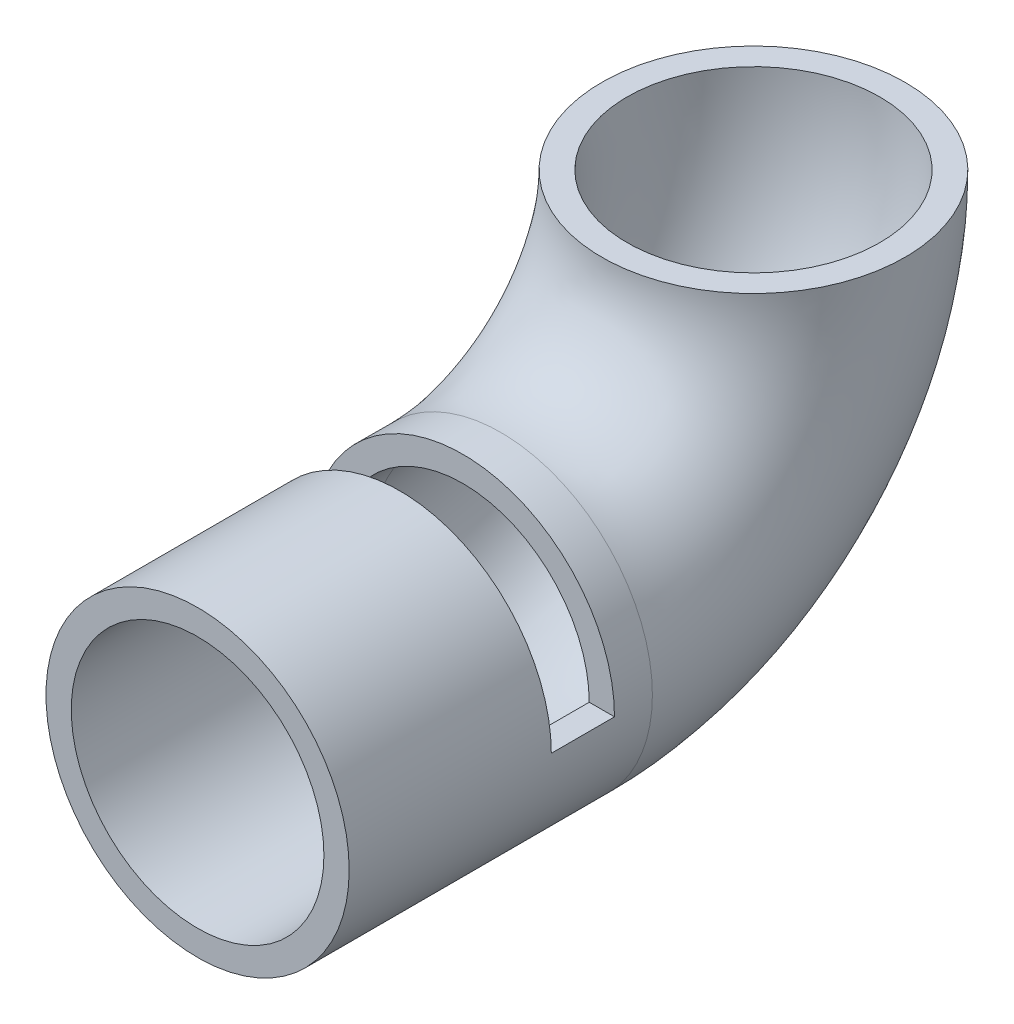
ISO-10303-21;
HEADER;
FILE_DESCRIPTION(('STEP AP214'),'2;1');
FILE_NAME('part.step','',(''),(''),'','','');
FILE_SCHEMA(('AUTOMOTIVE_DESIGN { 1 0 10303 214 1 1 1 1 }'));
ENDSEC;
DATA;
#1=APPLICATION_CONTEXT('core data for automotive mechanical design processes');
#2=APPLICATION_PROTOCOL_DEFINITION('international standard','automotive_design',2000,#1);
#3=PRODUCT_CONTEXT('',#1,'mechanical');
#4=PRODUCT('Part','Part','',(#3));
#5=PRODUCT_RELATED_PRODUCT_CATEGORY('part','',(#4));
#6=PRODUCT_DEFINITION_FORMATION('','',#4);
#7=PRODUCT_DEFINITION_CONTEXT('part definition',#1,'design');
#8=PRODUCT_DEFINITION('design','',#6,#7);
#9=PRODUCT_DEFINITION_SHAPE('','',#8);
#10=(LENGTH_UNIT() NAMED_UNIT(*) SI_UNIT(.MILLI.,.METRE.));
#11=(NAMED_UNIT(*) PLANE_ANGLE_UNIT() SI_UNIT($,.RADIAN.));
#12=(NAMED_UNIT(*) SI_UNIT($,.STERADIAN.) SOLID_ANGLE_UNIT());
#13=UNCERTAINTY_MEASURE_WITH_UNIT(LENGTH_MEASURE(1.E-05),#10,'distance_accuracy_value','');
#14=(GEOMETRIC_REPRESENTATION_CONTEXT(3) GLOBAL_UNCERTAINTY_ASSIGNED_CONTEXT((#13)) GLOBAL_UNIT_ASSIGNED_CONTEXT((#10,
#11,#12)) REPRESENTATION_CONTEXT('',''));
#15=CARTESIAN_POINT('',(0.,0.,0.));
#16=DIRECTION('',(0.,0.,1.));
#17=DIRECTION('',(1.,0.,0.));
#18=AXIS2_PLACEMENT_3D('',#15,#16,#17);
#19=CARTESIAN_POINT('',(0.,0.,0.));
#20=DIRECTION('',(0.,0.,-1.));
#21=DIRECTION('',(0.,1.,0.));
#22=AXIS2_PLACEMENT_3D('',#19,#20,#21);
#23=CYLINDRICAL_SURFACE('',#22,19.05);
#24=CARTESIAN_POINT('',(0.,0.,0.));
#25=DIRECTION('',(0.,0.,1.));
#26=DIRECTION('',(1.,0.,0.));
#27=AXIS2_PLACEMENT_3D('',#24,#25,#26);
#28=CIRCLE('',#27,19.05);
#29=CARTESIAN_POINT('',(19.05,0.,0.));
#30=VERTEX_POINT('',#29);
#31=EDGE_CURVE('E109',#30,#30,#28,.T.);
#32=ORIENTED_EDGE('',*,*,#31,.F.);
#33=EDGE_LOOP('',(#32));
#34=FACE_BOUND('',#33,.T.);
#35=CARTESIAN_POINT('',(0.,0.,-38.1));
#36=DIRECTION('',(0.,0.,1.));
#37=DIRECTION('',(1.,0.,0.));
#38=AXIS2_PLACEMENT_3D('',#35,#36,#37);
#39=CIRCLE('',#38,19.05);
#40=CARTESIAN_POINT('',(0.,-19.05,-38.1));
#41=VERTEX_POINT('',#40);
#42=EDGE_CURVE('E37',#41,#41,#39,.T.);
#43=ORIENTED_EDGE('',*,*,#42,.T.);
#44=EDGE_LOOP('',(#43));
#45=FACE_BOUND('',#44,.T.);
#46=CARTESIAN_POINT('',(0.,0.,-33.3375));
#47=DIRECTION('',(0.,0.,1.));
#48=DIRECTION('',(1.,0.,0.));
#49=AXIS2_PLACEMENT_3D('',#46,#47,#48);
#50=CIRCLE('',#49,19.05);
#51=CARTESIAN_POINT('',(19.05,0.,-33.3375));
#52=VERTEX_POINT('',#51);
#53=CARTESIAN_POINT('',(-19.05,0.,-33.3375));
#54=VERTEX_POINT('',#53);
#55=EDGE_CURVE('E85',#52,#54,#50,.T.);
#56=ORIENTED_EDGE('',*,*,#55,.F.);
#57=DIRECTION('',(0.,0.,1.));
#58=VECTOR('',#57,1.);
#59=CARTESIAN_POINT('',(19.05,0.,-33.3375));
#60=LINE('',#59,#58);
#61=CARTESIAN_POINT('',(19.05,0.,-25.4));
#62=VERTEX_POINT('',#61);
#63=EDGE_CURVE('E114',#52,#62,#60,.T.);
#64=ORIENTED_EDGE('',*,*,#63,.T.);
#65=CARTESIAN_POINT('',(0.,0.,-25.4));
#66=DIRECTION('',(0.,0.,1.));
#67=DIRECTION('',(1.,0.,0.));
#68=AXIS2_PLACEMENT_3D('',#65,#66,#67);
#69=CIRCLE('',#68,19.05);
#70=CARTESIAN_POINT('',(-19.05,0.,-25.4));
#71=VERTEX_POINT('',#70);
#72=EDGE_CURVE('E95',#62,#71,#69,.T.);
#73=ORIENTED_EDGE('',*,*,#72,.T.);
#74=DIRECTION('',(0.,0.,1.));
#75=VECTOR('',#74,1.);
#76=CARTESIAN_POINT('',(-19.05,0.,-33.3375));
#77=LINE('',#76,#75);
#78=EDGE_CURVE('E78',#54,#71,#77,.T.);
#79=ORIENTED_EDGE('',*,*,#78,.F.);
#80=EDGE_LOOP('',(#56,#64,#73,#79));
#81=FACE_BOUND('',#80,.T.);
#82=ADVANCED_FACE('F33',(#34,#45,#81),#23,.T.);
#83=CARTESIAN_POINT('',(0.,0.,0.));
#84=DIRECTION('',(0.,0.,-1.));
#85=DIRECTION('',(0.,1.,0.));
#86=AXIS2_PLACEMENT_3D('',#83,#84,#85);
#87=CYLINDRICAL_SURFACE('',#86,15.875);
#88=CARTESIAN_POINT('',(0.,0.,0.));
#89=DIRECTION('',(0.,0.,1.));
#90=DIRECTION('',(1.,0.,0.));
#91=AXIS2_PLACEMENT_3D('',#88,#89,#90);
#92=CIRCLE('',#91,15.875);
#93=CARTESIAN_POINT('',(15.875,0.,0.));
#94=VERTEX_POINT('',#93);
#95=EDGE_CURVE('E102',#94,#94,#92,.F.);
#96=ORIENTED_EDGE('',*,*,#95,.F.);
#97=EDGE_LOOP('',(#96));
#98=FACE_BOUND('',#97,.T.);
#99=CARTESIAN_POINT('',(0.,0.,-38.1));
#100=DIRECTION('',(0.,0.,1.));
#101=DIRECTION('',(1.,0.,0.));
#102=AXIS2_PLACEMENT_3D('',#99,#100,#101);
#103=CIRCLE('',#102,15.875);
#104=CARTESIAN_POINT('',(0.,-15.875,-38.1));
#105=VERTEX_POINT('',#104);
#106=EDGE_CURVE('E42',#105,#105,#103,.F.);
#107=ORIENTED_EDGE('',*,*,#106,.T.);
#108=EDGE_LOOP('',(#107));
#109=FACE_BOUND('',#108,.T.);
#110=CARTESIAN_POINT('',(0.,0.,-33.3375));
#111=DIRECTION('',(0.,0.,-1.));
#112=DIRECTION('',(1.,0.,0.));
#113=AXIS2_PLACEMENT_3D('',#110,#111,#112);
#114=CIRCLE('',#113,15.875);
#115=CARTESIAN_POINT('',(-15.875,0.,-33.3375));
#116=VERTEX_POINT('',#115);
#117=CARTESIAN_POINT('',(15.875,0.,-33.3375));
#118=VERTEX_POINT('',#117);
#119=EDGE_CURVE('E84',#116,#118,#114,.T.);
#120=ORIENTED_EDGE('',*,*,#119,.F.);
#121=DIRECTION('',(0.,0.,1.));
#122=VECTOR('',#121,1.);
#123=CARTESIAN_POINT('',(-15.875,0.,-33.3375));
#124=LINE('',#123,#122);
#125=CARTESIAN_POINT('',(-15.875,0.,-25.4));
#126=VERTEX_POINT('',#125);
#127=EDGE_CURVE('E81',#116,#126,#124,.T.);
#128=ORIENTED_EDGE('',*,*,#127,.T.);
#129=CARTESIAN_POINT('',(0.,0.,-25.4));
#130=DIRECTION('',(0.,0.,-1.));
#131=DIRECTION('',(1.,0.,0.));
#132=AXIS2_PLACEMENT_3D('',#129,#130,#131);
#133=CIRCLE('',#132,15.875);
#134=CARTESIAN_POINT('',(15.875,0.,-25.4));
#135=VERTEX_POINT('',#134);
#136=EDGE_CURVE('E120',#126,#135,#133,.T.);
#137=ORIENTED_EDGE('',*,*,#136,.T.);
#138=DIRECTION('',(0.,0.,1.));
#139=VECTOR('',#138,1.);
#140=CARTESIAN_POINT('',(15.875,0.,-33.3375));
#141=LINE('',#140,#139);
#142=EDGE_CURVE('E97',#118,#135,#141,.T.);
#143=ORIENTED_EDGE('',*,*,#142,.F.);
#144=EDGE_LOOP('',(#120,#128,#137,#143));
#145=FACE_BOUND('',#144,.T.);
#146=ADVANCED_FACE('F129',(#98,#109,#145),#87,.F.);
#147=CARTESIAN_POINT('',(0.,31.75,-38.1));
#148=DIRECTION('',(1.,0.,0.));
#149=DIRECTION('',(0.,0.,-1.));
#150=AXIS2_PLACEMENT_3D('',#147,#148,#149);
#151=TOROIDAL_SURFACE('',#150,31.75,19.05);
#152=CARTESIAN_POINT('',(0.,31.75,-69.85));
#153=DIRECTION('',(0.,-1.,0.));
#154=DIRECTION('',(1.,0.,0.));
#155=AXIS2_PLACEMENT_3D('',#152,#153,#154);
#156=CIRCLE('',#155,19.05);
#157=CARTESIAN_POINT('',(0.,31.75,-88.9));
#158=VERTEX_POINT('',#157);
#159=EDGE_CURVE('E105',#158,#158,#156,.T.);
#160=CARTESIAN_POINT('',(0.,31.75,-38.1));
#161=DIRECTION('',(1.,0.,0.));
#162=DIRECTION('',(0.,0.,-1.));
#163=AXIS2_PLACEMENT_3D('',#160,#161,#162);
#164=CIRCLE('',#163,50.8);
#165=EDGE_CURVE('',#41,#158,#164,.T.);
#166=ORIENTED_EDGE('',*,*,#42,.F.);
#167=ORIENTED_EDGE('',*,*,#159,.T.);
#168=ORIENTED_EDGE('',*,*,#165,.T.);
#169=ORIENTED_EDGE('',*,*,#165,.F.);
#170=EDGE_LOOP('',(#166,#168,#167,#169));
#171=FACE_BOUND('',#170,.T.);
#172=ADVANCED_FACE('F35',(#171),#151,.T.);
#173=CARTESIAN_POINT('',(0.,0.,0.));
#174=DIRECTION('',(0.,0.,1.));
#175=DIRECTION('',(1.,0.,0.));
#176=AXIS2_PLACEMENT_3D('',#173,#174,#175);
#177=PLANE('',#176);
#178=ORIENTED_EDGE('',*,*,#95,.T.);
#179=EDGE_LOOP('',(#178));
#180=FACE_BOUND('',#179,.T.);
#181=ORIENTED_EDGE('',*,*,#31,.T.);
#182=EDGE_LOOP('',(#181));
#183=FACE_BOUND('',#182,.T.);
#184=ADVANCED_FACE('F147',(#180,#183),#177,.T.);
#185=CARTESIAN_POINT('',(0.,31.75,-69.85));
#186=DIRECTION('',(0.,-1.,0.));
#187=DIRECTION('',(1.,0.,0.));
#188=AXIS2_PLACEMENT_3D('',#185,#186,#187);
#189=PLANE('',#188);
#190=CARTESIAN_POINT('',(0.,31.75,-69.85));
#191=DIRECTION('',(0.,-1.,0.));
#192=DIRECTION('',(1.,0.,0.));
#193=AXIS2_PLACEMENT_3D('',#190,#191,#192);
#194=CIRCLE('',#193,15.875);
#195=CARTESIAN_POINT('',(0.,31.75,-85.725));
#196=VERTEX_POINT('',#195);
#197=EDGE_CURVE('E11',#196,#196,#194,.F.);
#198=ORIENTED_EDGE('',*,*,#197,.F.);
#199=EDGE_LOOP('',(#198));
#200=FACE_BOUND('',#199,.T.);
#201=ORIENTED_EDGE('',*,*,#159,.F.);
#202=EDGE_LOOP('',(#201));
#203=FACE_BOUND('',#202,.T.);
#204=ADVANCED_FACE('F150',(#200,#203),#189,.F.);
#205=CARTESIAN_POINT('',(0.,31.75,-38.1));
#206=DIRECTION('',(1.,0.,0.));
#207=DIRECTION('',(0.,0.,-1.));
#208=AXIS2_PLACEMENT_3D('',#205,#206,#207);
#209=TOROIDAL_SURFACE('',#208,31.75,15.875);
#210=CARTESIAN_POINT('',(0.,31.75,-38.1));
#211=DIRECTION('',(1.,0.,0.));
#212=DIRECTION('',(0.,0.,-1.));
#213=AXIS2_PLACEMENT_3D('',#210,#211,#212);
#214=CIRCLE('',#213,47.625);
#215=EDGE_CURVE('',#105,#196,#214,.T.);
#216=ORIENTED_EDGE('',*,*,#106,.F.);
#217=ORIENTED_EDGE('',*,*,#197,.T.);
#218=ORIENTED_EDGE('',*,*,#215,.T.);
#219=ORIENTED_EDGE('',*,*,#215,.F.);
#220=EDGE_LOOP('',(#216,#218,#217,#219));
#221=FACE_BOUND('',#220,.T.);
#222=ADVANCED_FACE('F145',(#221),#209,.F.);
#223=CARTESIAN_POINT('',(15.875,0.,-33.3375));
#224=DIRECTION('',(0.,-1.,0.));
#225=DIRECTION('',(0.,0.,-1.));
#226=AXIS2_PLACEMENT_3D('',#223,#224,#225);
#227=PLANE('',#226);
#228=DIRECTION('',(1.,0.,0.));
#229=VECTOR('',#228,1.);
#230=CARTESIAN_POINT('',(15.875,0.,-25.4));
#231=LINE('',#230,#229);
#232=EDGE_CURVE('E55',#135,#62,#231,.T.);
#233=ORIENTED_EDGE('',*,*,#232,.T.);
#234=ORIENTED_EDGE('',*,*,#63,.F.);
#235=DIRECTION('',(1.,0.,0.));
#236=VECTOR('',#235,1.);
#237=CARTESIAN_POINT('',(15.875,0.,-33.3375));
#238=LINE('',#237,#236);
#239=EDGE_CURVE('E91',#118,#52,#238,.T.);
#240=ORIENTED_EDGE('',*,*,#239,.F.);
#241=ORIENTED_EDGE('',*,*,#142,.T.);
#242=EDGE_LOOP('',(#233,#234,#240,#241));
#243=FACE_BOUND('',#242,.T.);
#244=ADVANCED_FACE('F128',(#243),#227,.F.);
#245=CARTESIAN_POINT('',(-19.05,0.,-33.3375));
#246=DIRECTION('',(0.,-1.,0.));
#247=DIRECTION('',(0.,0.,-1.));
#248=AXIS2_PLACEMENT_3D('',#245,#246,#247);
#249=PLANE('',#248);
#250=DIRECTION('',(1.,0.,0.));
#251=VECTOR('',#250,1.);
#252=CARTESIAN_POINT('',(-19.05,0.,-25.4));
#253=LINE('',#252,#251);
#254=EDGE_CURVE('E50',#71,#126,#253,.T.);
#255=ORIENTED_EDGE('',*,*,#254,.T.);
#256=ORIENTED_EDGE('',*,*,#127,.F.);
#257=DIRECTION('',(1.,0.,0.));
#258=VECTOR('',#257,1.);
#259=CARTESIAN_POINT('',(-19.05,0.,-33.3375));
#260=LINE('',#259,#258);
#261=EDGE_CURVE('E74',#54,#116,#260,.T.);
#262=ORIENTED_EDGE('',*,*,#261,.F.);
#263=ORIENTED_EDGE('',*,*,#78,.T.);
#264=EDGE_LOOP('',(#255,#256,#262,#263));
#265=FACE_BOUND('',#264,.T.);
#266=ADVANCED_FACE('F76',(#265),#249,.F.);
#267=CARTESIAN_POINT('',(0.,0.,-33.3375));
#268=DIRECTION('',(0.,0.,1.));
#269=DIRECTION('',(1.,0.,0.));
#270=AXIS2_PLACEMENT_3D('',#267,#268,#269);
#271=PLANE('',#270);
#272=ORIENTED_EDGE('',*,*,#55,.T.);
#273=ORIENTED_EDGE('',*,*,#261,.T.);
#274=ORIENTED_EDGE('',*,*,#119,.T.);
#275=ORIENTED_EDGE('',*,*,#239,.T.);
#276=EDGE_LOOP('',(#272,#273,#274,#275));
#277=FACE_BOUND('',#276,.T.);
#278=ADVANCED_FACE('F89',(#277),#271,.T.);
#279=CARTESIAN_POINT('',(0.,0.,-25.4));
#280=DIRECTION('',(0.,0.,1.));
#281=DIRECTION('',(1.,0.,0.));
#282=AXIS2_PLACEMENT_3D('',#279,#280,#281);
#283=PLANE('',#282);
#284=ORIENTED_EDGE('',*,*,#72,.F.);
#285=ORIENTED_EDGE('',*,*,#232,.F.);
#286=ORIENTED_EDGE('',*,*,#136,.F.);
#287=ORIENTED_EDGE('',*,*,#254,.F.);
#288=EDGE_LOOP('',(#284,#285,#286,#287));
#289=FACE_BOUND('',#288,.T.);
#290=ADVANCED_FACE('F130',(#289),#283,.F.);
#291=CLOSED_SHELL('',(#82,#146,#172,#184,#204,#222,#244,#266,#278,#290));
#292=MANIFOLD_SOLID_BREP('B2',#291);
#293=ADVANCED_BREP_SHAPE_REPRESENTATION('',(#18,#292),#14);
#294=SHAPE_DEFINITION_REPRESENTATION(#9,#293);
ENDSEC;
END-ISO-10303-21;
